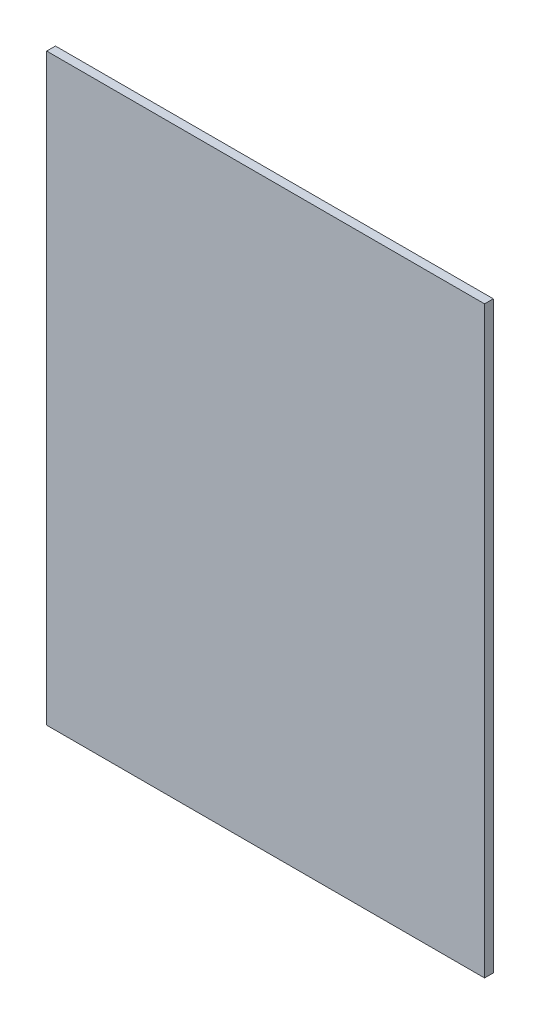
ISO-10303-21;
HEADER;
FILE_DESCRIPTION(('STEP AP214'),'2;1');
FILE_NAME('part.step','',(''),(''),'','','');
FILE_SCHEMA(('AUTOMOTIVE_DESIGN { 1 0 10303 214 1 1 1 1 }'));
ENDSEC;
DATA;
#1=APPLICATION_CONTEXT('core data for automotive mechanical design processes');
#2=APPLICATION_PROTOCOL_DEFINITION('international standard','automotive_design',2000,#1);
#3=PRODUCT_CONTEXT('',#1,'mechanical');
#4=PRODUCT('Part','Part','',(#3));
#5=PRODUCT_RELATED_PRODUCT_CATEGORY('part','',(#4));
#6=PRODUCT_DEFINITION_FORMATION('','',#4);
#7=PRODUCT_DEFINITION_CONTEXT('part definition',#1,'design');
#8=PRODUCT_DEFINITION('design','',#6,#7);
#9=PRODUCT_DEFINITION_SHAPE('','',#8);
#10=(LENGTH_UNIT() NAMED_UNIT(*) SI_UNIT(.MILLI.,.METRE.));
#11=(NAMED_UNIT(*) PLANE_ANGLE_UNIT() SI_UNIT($,.RADIAN.));
#12=(NAMED_UNIT(*) SI_UNIT($,.STERADIAN.) SOLID_ANGLE_UNIT());
#13=UNCERTAINTY_MEASURE_WITH_UNIT(LENGTH_MEASURE(1.E-05),#10,'distance_accuracy_value','');
#14=(GEOMETRIC_REPRESENTATION_CONTEXT(3) GLOBAL_UNCERTAINTY_ASSIGNED_CONTEXT((#13)) GLOBAL_UNIT_ASSIGNED_CONTEXT((#10,
#11,#12)) REPRESENTATION_CONTEXT('',''));
#15=CARTESIAN_POINT('',(0.,0.,0.));
#16=DIRECTION('',(0.,0.,1.));
#17=DIRECTION('',(1.,0.,0.));
#18=AXIS2_PLACEMENT_3D('',#15,#16,#17);
#19=CARTESIAN_POINT('',(75.,-99.9999999999999,3.));
#20=DIRECTION('',(-1.,0.,0.));
#21=DIRECTION('',(0.,0.,1.));
#22=AXIS2_PLACEMENT_3D('',#19,#20,#21);
#23=PLANE('',#22);
#24=DIRECTION('',(0.,1.,0.));
#25=VECTOR('',#24,1.);
#26=CARTESIAN_POINT('',(75.,-99.9999999999999,0.));
#27=LINE('',#26,#25);
#28=CARTESIAN_POINT('',(75.,-99.9999999999999,0.));
#29=VERTEX_POINT('',#28);
#30=CARTESIAN_POINT('',(75.,100.,0.));
#31=VERTEX_POINT('',#30);
#32=EDGE_CURVE('E102',#29,#31,#27,.T.);
#33=ORIENTED_EDGE('',*,*,#32,.T.);
#34=DIRECTION('',(0.,0.,-1.));
#35=VECTOR('',#34,1.);
#36=CARTESIAN_POINT('',(75.,100.,3.));
#37=LINE('',#36,#35);
#38=CARTESIAN_POINT('',(75.,100.,3.));
#39=VERTEX_POINT('',#38);
#40=EDGE_CURVE('E11',#39,#31,#37,.T.);
#41=ORIENTED_EDGE('',*,*,#40,.F.);
#42=DIRECTION('',(0.,1.,0.));
#43=VECTOR('',#42,1.);
#44=CARTESIAN_POINT('',(75.,-99.9999999999999,3.));
#45=LINE('',#44,#43);
#46=CARTESIAN_POINT('',(75.,-99.9999999999999,3.));
#47=VERTEX_POINT('',#46);
#48=EDGE_CURVE('E90',#47,#39,#45,.T.);
#49=ORIENTED_EDGE('',*,*,#48,.F.);
#50=DIRECTION('',(0.,0.,-1.));
#51=VECTOR('',#50,1.);
#52=CARTESIAN_POINT('',(75.,-99.9999999999999,3.));
#53=LINE('',#52,#51);
#54=EDGE_CURVE('E98',#47,#29,#53,.T.);
#55=ORIENTED_EDGE('',*,*,#54,.T.);
#56=EDGE_LOOP('',(#33,#41,#49,#55));
#57=FACE_BOUND('',#56,.T.);
#58=ADVANCED_FACE('F39',(#57),#23,.F.);
#59=CARTESIAN_POINT('',(-75.,100.,3.));
#60=DIRECTION('',(0.,-1.,0.));
#61=DIRECTION('',(0.,0.,-1.));
#62=AXIS2_PLACEMENT_3D('',#59,#60,#61);
#63=PLANE('',#62);
#64=DIRECTION('',(-1.,0.,0.));
#65=VECTOR('',#64,1.);
#66=CARTESIAN_POINT('',(-75.,100.,0.));
#67=LINE('',#66,#65);
#68=CARTESIAN_POINT('',(-75.,100.,0.));
#69=VERTEX_POINT('',#68);
#70=EDGE_CURVE('E94',#31,#69,#67,.T.);
#71=ORIENTED_EDGE('',*,*,#70,.T.);
#72=DIRECTION('',(0.,0.,-1.));
#73=VECTOR('',#72,1.);
#74=CARTESIAN_POINT('',(-75.,100.,3.));
#75=LINE('',#74,#73);
#76=CARTESIAN_POINT('',(-75.,100.,3.));
#77=VERTEX_POINT('',#76);
#78=EDGE_CURVE('E47',#77,#69,#75,.T.);
#79=ORIENTED_EDGE('',*,*,#78,.F.);
#80=DIRECTION('',(-1.,0.,0.));
#81=VECTOR('',#80,1.);
#82=CARTESIAN_POINT('',(-75.,100.,3.));
#83=LINE('',#82,#81);
#84=EDGE_CURVE('E85',#39,#77,#83,.T.);
#85=ORIENTED_EDGE('',*,*,#84,.F.);
#86=ORIENTED_EDGE('',*,*,#40,.T.);
#87=EDGE_LOOP('',(#71,#79,#85,#86));
#88=FACE_BOUND('',#87,.T.);
#89=ADVANCED_FACE('F93',(#88),#63,.F.);
#90=CARTESIAN_POINT('',(-75.,-99.9999999999999,3.));
#91=DIRECTION('',(1.,0.,0.));
#92=DIRECTION('',(0.,0.,-1.));
#93=AXIS2_PLACEMENT_3D('',#90,#91,#92);
#94=PLANE('',#93);
#95=DIRECTION('',(0.,-1.,0.));
#96=VECTOR('',#95,1.);
#97=CARTESIAN_POINT('',(-75.,-99.9999999999999,0.));
#98=LINE('',#97,#96);
#99=CARTESIAN_POINT('',(-75.,-99.9999999999999,0.));
#100=VERTEX_POINT('',#99);
#101=EDGE_CURVE('E72',#69,#100,#98,.T.);
#102=ORIENTED_EDGE('',*,*,#101,.T.);
#103=DIRECTION('',(0.,0.,-1.));
#104=VECTOR('',#103,1.);
#105=CARTESIAN_POINT('',(-75.,-99.9999999999999,3.));
#106=LINE('',#105,#104);
#107=CARTESIAN_POINT('',(-75.,-99.9999999999999,3.));
#108=VERTEX_POINT('',#107);
#109=EDGE_CURVE('E95',#108,#100,#106,.T.);
#110=ORIENTED_EDGE('',*,*,#109,.F.);
#111=DIRECTION('',(0.,-1.,0.));
#112=VECTOR('',#111,1.);
#113=CARTESIAN_POINT('',(-75.,-99.9999999999999,3.));
#114=LINE('',#113,#112);
#115=EDGE_CURVE('E88',#77,#108,#114,.T.);
#116=ORIENTED_EDGE('',*,*,#115,.F.);
#117=ORIENTED_EDGE('',*,*,#78,.T.);
#118=EDGE_LOOP('',(#102,#110,#116,#117));
#119=FACE_BOUND('',#118,.T.);
#120=ADVANCED_FACE('F96',(#119),#94,.F.);
#121=CARTESIAN_POINT('',(-75.,-99.9999999999999,3.));
#122=DIRECTION('',(0.,1.,0.));
#123=DIRECTION('',(0.,0.,1.));
#124=AXIS2_PLACEMENT_3D('',#121,#122,#123);
#125=PLANE('',#124);
#126=DIRECTION('',(1.,0.,0.));
#127=VECTOR('',#126,1.);
#128=CARTESIAN_POINT('',(-75.,-99.9999999999999,0.));
#129=LINE('',#128,#127);
#130=EDGE_CURVE('E78',#100,#29,#129,.T.);
#131=ORIENTED_EDGE('',*,*,#130,.T.);
#132=ORIENTED_EDGE('',*,*,#54,.F.);
#133=DIRECTION('',(1.,0.,0.));
#134=VECTOR('',#133,1.);
#135=CARTESIAN_POINT('',(-75.,-99.9999999999999,3.));
#136=LINE('',#135,#134);
#137=EDGE_CURVE('E55',#108,#47,#136,.T.);
#138=ORIENTED_EDGE('',*,*,#137,.F.);
#139=ORIENTED_EDGE('',*,*,#109,.T.);
#140=EDGE_LOOP('',(#131,#132,#138,#139));
#141=FACE_BOUND('',#140,.T.);
#142=ADVANCED_FACE('F109',(#141),#125,.F.);
#143=CARTESIAN_POINT('',(0.,0.,3.));
#144=DIRECTION('',(0.,0.,-1.));
#145=DIRECTION('',(-1.,0.,0.));
#146=AXIS2_PLACEMENT_3D('',#143,#144,#145);
#147=PLANE('',#146);
#148=ORIENTED_EDGE('',*,*,#48,.T.);
#149=ORIENTED_EDGE('',*,*,#84,.T.);
#150=ORIENTED_EDGE('',*,*,#115,.T.);
#151=ORIENTED_EDGE('',*,*,#137,.T.);
#152=EDGE_LOOP('',(#148,#149,#150,#151));
#153=FACE_BOUND('',#152,.T.);
#154=ADVANCED_FACE('F86',(#153),#147,.F.);
#155=CARTESIAN_POINT('',(0.,0.,0.));
#156=DIRECTION('',(0.,0.,-1.));
#157=DIRECTION('',(-1.,0.,0.));
#158=AXIS2_PLACEMENT_3D('',#155,#156,#157);
#159=PLANE('',#158);
#160=ORIENTED_EDGE('',*,*,#32,.F.);
#161=ORIENTED_EDGE('',*,*,#130,.F.);
#162=ORIENTED_EDGE('',*,*,#101,.F.);
#163=ORIENTED_EDGE('',*,*,#70,.F.);
#164=EDGE_LOOP('',(#160,#161,#162,#163));
#165=FACE_BOUND('',#164,.T.);
#166=ADVANCED_FACE('F112',(#165),#159,.T.);
#167=CLOSED_SHELL('',(#58,#89,#120,#142,#154,#166));
#168=MANIFOLD_SOLID_BREP('B2',#167);
#169=ADVANCED_BREP_SHAPE_REPRESENTATION('',(#18,#168),#14);
#170=SHAPE_DEFINITION_REPRESENTATION(#9,#169);
ENDSEC;
END-ISO-10303-21;
